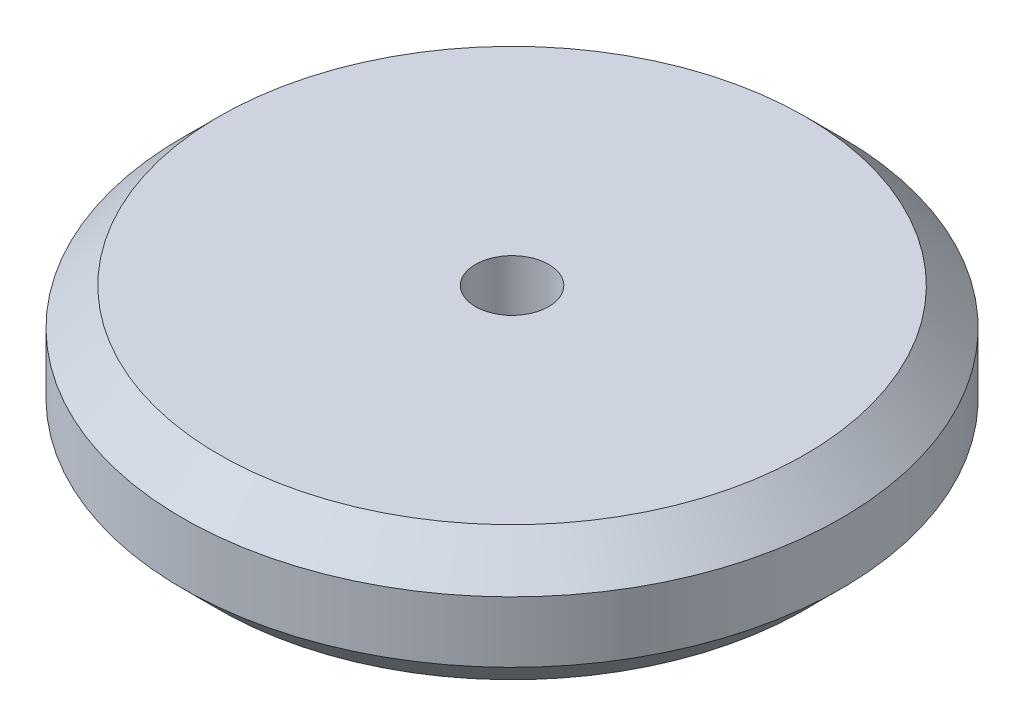
ISO-10303-21;
HEADER;
FILE_DESCRIPTION(('STEP AP214'),'2;1');
FILE_NAME('part.step','',(''),(''),'','','');
FILE_SCHEMA(('AUTOMOTIVE_DESIGN { 1 0 10303 214 1 1 1 1 }'));
ENDSEC;
DATA;
#1=APPLICATION_CONTEXT('core data for automotive mechanical design processes');
#2=APPLICATION_PROTOCOL_DEFINITION('international standard','automotive_design',2000,#1);
#3=PRODUCT_CONTEXT('',#1,'mechanical');
#4=PRODUCT('Part','Part','',(#3));
#5=PRODUCT_RELATED_PRODUCT_CATEGORY('part','',(#4));
#6=PRODUCT_DEFINITION_FORMATION('','',#4);
#7=PRODUCT_DEFINITION_CONTEXT('part definition',#1,'design');
#8=PRODUCT_DEFINITION('design','',#6,#7);
#9=PRODUCT_DEFINITION_SHAPE('','',#8);
#10=(LENGTH_UNIT() NAMED_UNIT(*) SI_UNIT(.MILLI.,.METRE.));
#11=(NAMED_UNIT(*) PLANE_ANGLE_UNIT() SI_UNIT($,.RADIAN.));
#12=(NAMED_UNIT(*) SI_UNIT($,.STERADIAN.) SOLID_ANGLE_UNIT());
#13=UNCERTAINTY_MEASURE_WITH_UNIT(LENGTH_MEASURE(1.E-05),#10,'distance_accuracy_value','');
#14=(GEOMETRIC_REPRESENTATION_CONTEXT(3) GLOBAL_UNCERTAINTY_ASSIGNED_CONTEXT((#13)) GLOBAL_UNIT_ASSIGNED_CONTEXT((#10,
#11,#12)) REPRESENTATION_CONTEXT('',''));
#15=CARTESIAN_POINT('',(0.,0.,0.));
#16=DIRECTION('',(0.,0.,1.));
#17=DIRECTION('',(1.,0.,0.));
#18=AXIS2_PLACEMENT_3D('',#15,#16,#17);
#19=CARTESIAN_POINT('',(10.,6.,0.));
#20=DIRECTION('',(0.,-1.,0.));
#21=DIRECTION('',(0.,0.,-1.));
#22=AXIS2_PLACEMENT_3D('',#19,#20,#21);
#23=PLANE('',#22);
#24=CARTESIAN_POINT('',(0.,6.,0.));
#25=DIRECTION('',(0.,-1.,0.));
#26=DIRECTION('',(0.,0.,-1.));
#27=AXIS2_PLACEMENT_3D('',#24,#25,#26);
#28=CIRCLE('',#27,24.);
#29=CARTESIAN_POINT('',(0.,6.,-24.));
#30=VERTEX_POINT('',#29);
#31=EDGE_CURVE('E10',#30,#30,#28,.T.);
#32=ORIENTED_EDGE('',*,*,#31,.T.);
#33=EDGE_LOOP('',(#32));
#34=FACE_BOUND('',#33,.T.);
#35=CARTESIAN_POINT('',(0.,6.,0.));
#36=DIRECTION('',(0.,-1.,0.));
#37=DIRECTION('',(0.,0.,-1.));
#38=AXIS2_PLACEMENT_3D('',#35,#36,#37);
#39=CIRCLE('',#38,10.);
#40=CARTESIAN_POINT('',(0.,6.,-10.));
#41=VERTEX_POINT('',#40);
#42=EDGE_CURVE('E64',#41,#41,#39,.T.);
#43=ORIENTED_EDGE('',*,*,#42,.F.);
#44=EDGE_LOOP('',(#43));
#45=FACE_BOUND('',#44,.T.);
#46=ADVANCED_FACE('F31',(#34,#45),#23,.T.);
#47=CARTESIAN_POINT('',(0.,6.,0.));
#48=DIRECTION('',(0.,1.,0.));
#49=DIRECTION('',(0.,0.,1.));
#50=AXIS2_PLACEMENT_3D('',#47,#48,#49);
#51=CONICAL_SURFACE('',#50,24.,0.785398163397448);
#52=CARTESIAN_POINT('',(0.,9.,0.));
#53=DIRECTION('',(0.,-1.,0.));
#54=DIRECTION('',(0.,0.,-1.));
#55=AXIS2_PLACEMENT_3D('',#52,#53,#54);
#56=CIRCLE('',#55,27.);
#57=CARTESIAN_POINT('',(0.,9.,-27.));
#58=VERTEX_POINT('',#57);
#59=EDGE_CURVE('E43',#58,#58,#56,.T.);
#60=ORIENTED_EDGE('',*,*,#59,.T.);
#61=EDGE_LOOP('',(#60));
#62=FACE_BOUND('',#61,.T.);
#63=ORIENTED_EDGE('',*,*,#31,.F.);
#64=EDGE_LOOP('',(#63));
#65=FACE_BOUND('',#64,.T.);
#66=ADVANCED_FACE('F96',(#62,#65),#51,.T.);
#67=CARTESIAN_POINT('',(0.,0.,0.));
#68=DIRECTION('',(0.,-1.,0.));
#69=DIRECTION('',(0.,0.,-1.));
#70=AXIS2_PLACEMENT_3D('',#67,#68,#69);
#71=CYLINDRICAL_SURFACE('',#70,27.);
#72=CARTESIAN_POINT('',(0.,14.,0.));
#73=DIRECTION('',(0.,-1.,0.));
#74=DIRECTION('',(0.,0.,-1.));
#75=AXIS2_PLACEMENT_3D('',#72,#73,#74);
#76=CIRCLE('',#75,27.);
#77=CARTESIAN_POINT('',(0.,14.,-27.));
#78=VERTEX_POINT('',#77);
#79=EDGE_CURVE('E47',#78,#78,#76,.T.);
#80=ORIENTED_EDGE('',*,*,#79,.T.);
#81=EDGE_LOOP('',(#80));
#82=FACE_BOUND('',#81,.T.);
#83=ORIENTED_EDGE('',*,*,#59,.F.);
#84=EDGE_LOOP('',(#83));
#85=FACE_BOUND('',#84,.T.);
#86=ADVANCED_FACE('F100',(#82,#85),#71,.T.);
#87=CARTESIAN_POINT('',(0.,14.,0.));
#88=DIRECTION('',(0.,-1.,0.));
#89=DIRECTION('',(0.,0.,-1.));
#90=AXIS2_PLACEMENT_3D('',#87,#88,#89);
#91=CONICAL_SURFACE('',#90,27.,0.785398163397448);
#92=CARTESIAN_POINT('',(0.,17.,0.));
#93=DIRECTION('',(0.,-1.,0.));
#94=DIRECTION('',(0.,0.,-1.));
#95=AXIS2_PLACEMENT_3D('',#92,#93,#94);
#96=CIRCLE('',#95,24.);
#97=CARTESIAN_POINT('',(0.,17.,-24.));
#98=VERTEX_POINT('',#97);
#99=EDGE_CURVE('E52',#98,#98,#96,.T.);
#100=ORIENTED_EDGE('',*,*,#99,.T.);
#101=EDGE_LOOP('',(#100));
#102=FACE_BOUND('',#101,.T.);
#103=ORIENTED_EDGE('',*,*,#79,.F.);
#104=EDGE_LOOP('',(#103));
#105=FACE_BOUND('',#104,.T.);
#106=ADVANCED_FACE('F110',(#102,#105),#91,.T.);
#107=CARTESIAN_POINT('',(24.,17.,0.));
#108=DIRECTION('',(0.,1.,0.));
#109=DIRECTION('',(0.,0.,1.));
#110=AXIS2_PLACEMENT_3D('',#107,#108,#109);
#111=PLANE('',#110);
#112=CARTESIAN_POINT('',(0.,17.,0.));
#113=DIRECTION('',(0.,-1.,0.));
#114=DIRECTION('',(0.,0.,-1.));
#115=AXIS2_PLACEMENT_3D('',#112,#113,#114);
#116=CIRCLE('',#115,3.);
#117=CARTESIAN_POINT('',(0.,17.,-3.));
#118=VERTEX_POINT('',#117);
#119=EDGE_CURVE('E55',#118,#118,#116,.T.);
#120=ORIENTED_EDGE('',*,*,#119,.T.);
#121=EDGE_LOOP('',(#120));
#122=FACE_BOUND('',#121,.T.);
#123=ORIENTED_EDGE('',*,*,#99,.F.);
#124=EDGE_LOOP('',(#123));
#125=FACE_BOUND('',#124,.T.);
#126=ADVANCED_FACE('F92',(#122,#125),#111,.T.);
#127=CARTESIAN_POINT('',(0.,0.,0.));
#128=DIRECTION('',(0.,-1.,0.));
#129=DIRECTION('',(0.,0.,-1.));
#130=AXIS2_PLACEMENT_3D('',#127,#128,#129);
#131=CYLINDRICAL_SURFACE('',#130,3.);
#132=CARTESIAN_POINT('',(0.,4.65,-3.));
#133=CARTESIAN_POINT('',(-0.0856699475452996,4.64999461662169,-2.99999513886583));
#134=CARTESIAN_POINT('',(-0.171409071205646,4.64328935440902,-2.99629302255545));
#135=CARTESIAN_POINT('',(-0.340286051726048,4.61679778476964,-2.9818478399119));
#136=CARTESIAN_POINT('',(-0.423420195379861,4.59699362165197,-2.97109516282084));
#137=CARTESIAN_POINT('',(-0.584401577928637,4.54534553567832,-2.9436571869529));
#138=CARTESIAN_POINT('',(-0.662269062667419,4.51355122137034,-2.92699634956489));
#139=CARTESIAN_POINT('',(-0.811408240635763,4.43912133182606,-2.8892116252981));
#140=CARTESIAN_POINT('',(-0.882679651896674,4.39648529341993,-2.86808754775153));
#141=CARTESIAN_POINT('',(-1.02211619357275,4.29828466687541,-2.82153252993505));
#142=CARTESIAN_POINT('',(-1.08973037342791,4.24203247555586,-2.79590528013301));
#143=CARTESIAN_POINT('',(-1.21508634233517,4.1197083915399,-2.74375354722835));
#144=CARTESIAN_POINT('',(-1.2728189023456,4.05362742563047,-2.71722825277821));
#145=CARTESIAN_POINT('',(-1.38251917690996,3.90577401407734,-2.66321895829991));
#146=CARTESIAN_POINT('',(-1.43335857713387,3.82309703851528,-2.635897965792));
#147=CARTESIAN_POINT('',(-1.52021547735939,3.64877263436737,-2.58678336476683));
#148=CARTESIAN_POINT('',(-1.5562446891168,3.55713236514275,-2.56498539395023));
#149=CARTESIAN_POINT('',(-1.60989890926138,3.3732305515727,-2.53163475086558));
#150=CARTESIAN_POINT('',(-1.62854263347079,3.28137384654717,-2.51952192354843));
#151=CARTESIAN_POINT('',(-1.64991120631134,3.09511055144333,-2.5055890563389));
#152=CARTESIAN_POINT('',(-1.65265887915297,3.00070781297602,-2.50375425894471));
#153=CARTESIAN_POINT('',(-1.64290000078864,2.82757164325043,-2.51015646726158));
#154=CARTESIAN_POINT('',(-1.63265157443424,2.74864024150067,-2.51690299364892));
#155=CARTESIAN_POINT('',(-1.60118639026894,2.59387058009675,-2.53703527550373));
#156=CARTESIAN_POINT('',(-1.5799646365691,2.5180337463059,-2.55042405491467));
#157=CARTESIAN_POINT('',(-1.52687641342515,2.3695176799991,-2.58256130946142));
#158=CARTESIAN_POINT('',(-1.49479033069661,2.2969417622077,-2.60141910516922));
#159=CARTESIAN_POINT('',(-1.42107429999088,2.15782897940317,-2.64240902469132));
#160=CARTESIAN_POINT('',(-1.37944023253661,2.09129473841806,-2.66454256035721));
#161=CARTESIAN_POINT('',(-1.28018349411555,1.95510521641988,-2.71379040847905));
#162=CARTESIAN_POINT('',(-1.22107458392543,1.88661394811561,-2.74113957142577));
#163=CARTESIAN_POINT('',(-1.09224532196501,1.75997341934865,-2.79497377887706));
#164=CARTESIAN_POINT('',(-1.02251777065964,1.70183123410758,-2.82145822218593));
#165=CARTESIAN_POINT('',(-0.868605041800937,1.59378517331662,-2.87272134052732));
#166=CARTESIAN_POINT('',(-0.783763861453044,1.54469535937108,-2.89726648156192));
#167=CARTESIAN_POINT('',(-0.605352377645233,1.46191924656253,-2.93971528365153));
#168=CARTESIAN_POINT('',(-0.511790381195994,1.42821846583331,-2.95762518579738));
#169=CARTESIAN_POINT('',(-0.327907037980978,1.38038778956176,-2.98333345624201));
#170=CARTESIAN_POINT('',(-0.238095480523289,1.36472744848248,-2.99191822782612));
#171=CARTESIAN_POINT('',(-0.0567325334425137,1.34846917129306,-3.00083376662002));
#172=CARTESIAN_POINT('',(0.0348177069344345,1.34786161003821,-3.00116980828416));
#173=CARTESIAN_POINT('',(0.207487375150858,1.36103451330555,-2.99394177831786));
#174=CARTESIAN_POINT('',(0.28875177623744,1.37341460128179,-2.98714659587173));
#175=CARTESIAN_POINT('',(0.447838849624848,1.40984259733264,-2.96746793830126));
#176=CARTESIAN_POINT('',(0.525661172937911,1.43389168556646,-2.95458384737082));
#177=CARTESIAN_POINT('',(0.677753407865904,1.49335761595169,-2.92349378037743));
#178=CARTESIAN_POINT('',(0.751904240945377,1.52901769554692,-2.90517475144826));
#179=CARTESIAN_POINT('',(0.893363199749704,1.61037134629973,-2.86484215103297));
#180=CARTESIAN_POINT('',(0.960668811424108,1.65606858448361,-2.8428272299655));
#181=CARTESIAN_POINT('',(1.09455456288909,1.76204471413836,-2.79420331593949));
#182=CARTESIAN_POINT('',(1.16021004375818,1.823383283659,-2.76735592347542));
#183=CARTESIAN_POINT('',(1.28079913012788,1.95592442967749,-2.71365440736755));
#184=CARTESIAN_POINT('',(1.33572155748716,2.02713715928237,-2.6868003055646));
#185=CARTESIAN_POINT('',(1.43747254066661,2.18416419340713,-2.63385875511374));
#186=CARTESIAN_POINT('',(1.48334076829298,2.27068307687537,-2.60799295737883));
#187=CARTESIAN_POINT('',(1.55942876653783,2.45199407970866,-2.56323063992907));
#188=CARTESIAN_POINT('',(1.58967133039468,2.54677391139992,-2.54432398053561));
#189=CARTESIAN_POINT('',(1.6306246255404,2.73226237758553,-2.51825420457375));
#190=CARTESIAN_POINT('',(1.64294477567078,2.8224747805395,-2.51013022153208));
#191=CARTESIAN_POINT('',(1.65249034912289,3.00401046928804,-2.50386093509844));
#192=CARTESIAN_POINT('',(1.64972872967261,3.09533273427257,-2.50570706604924));
#193=CARTESIAN_POINT('',(1.63075691736925,3.26321952155551,-2.51807870697285));
#194=CARTESIAN_POINT('',(1.61642825416935,3.34010097353313,-2.52738874118223));
#195=CARTESIAN_POINT('',(1.57741079979876,3.49019541895998,-2.55192145753237));
#196=CARTESIAN_POINT('',(1.55271775279779,3.56340689160001,-2.56714656833463));
#197=CARTESIAN_POINT('',(1.492056117962,3.70913964629297,-2.60289749299613));
#198=CARTESIAN_POINT('',(1.45548954002739,3.7813439958992,-2.62369085726804));
#199=CARTESIAN_POINT('',(1.37268509596929,3.91907602150034,-2.66794671801683));
#200=CARTESIAN_POINT('',(1.32644209751913,3.98460012678668,-2.69141062791391));
#201=CARTESIAN_POINT('',(1.21715006880685,4.11784973955534,-2.74276036037727));
#202=CARTESIAN_POINT('',(1.15260264369496,4.18430823518329,-2.770762457364));
#203=CARTESIAN_POINT('',(1.01279351012944,4.30588442742214,-2.82486614857147));
#204=CARTESIAN_POINT('',(0.937524174112386,4.360993981549,-2.85096636964491));
#205=CARTESIAN_POINT('',(0.774887264813827,4.45993803396586,-2.89948189270181));
#206=CARTESIAN_POINT('',(0.687189892415591,4.50331356440636,-2.92173740350452));
#207=CARTESIAN_POINT('',(0.504223640414895,4.57410971433075,-2.95878417900051));
#208=CARTESIAN_POINT('',(0.408974898948851,4.60157124777073,-2.97359457153256));
#209=CARTESIAN_POINT('',(0.260510618519073,4.63014205801229,-2.98911434756595));
#210=CARTESIAN_POINT('',(0.208783056433922,4.63757243201226,-2.99318008334623));
#211=CARTESIAN_POINT('',(0.104712273399592,4.64750301282089,-2.99862437594613));
#212=CARTESIAN_POINT('',(0.0523690613485742,4.65000329079773,-3.00000297155585));
#213=CARTESIAN_POINT('',(0.,4.65,-3.));
#214=B_SPLINE_CURVE_WITH_KNOTS('',3,(#132,#133,#134,#135,#136,#137,#138,#139,#140,#141,#142,
#143,#144,#145,#146,#147,#148,#149,#150,#151,#152,#153,#154,#155,#156,#157,#158,#159,#160,#161,
#162,#163,#164,#165,#166,#167,#168,#169,#170,#171,#172,#173,#174,#175,#176,#177,#178,#179,#180,
#181,#182,#183,#184,#185,#186,#187,#188,#189,#190,#191,#192,#193,#194,#195,#196,#197,#198,#199,
#200,#201,#202,#203,#204,#205,#206,#207,#208,#209,#210,#211,#212,#213),.UNSPECIFIED.,.T.,.F.,(4,
2,2,2,2,2,2,2,2,2,2,2,2,2,2,2,2,2,2,2,2,2,2,2,2,2,2,2,2,2,2,2,2,2,2,2,2,2,2,2,4),(0.,
0.256799016537927,0.513948810602823,0.770046131883809,1.02615439574975,1.29988051794781,
1.57386091081864,1.87483382859252,2.17556827984511,2.45730761481344,2.7386423161532,
2.97715628850379,3.21577894619804,3.45954576386221,3.70341795322454,3.98576982265922,
4.26831398861797,4.56980790280871,4.87101750814851,5.14417314031287,5.41715410504554,
5.66345591892144,5.90978264803878,6.16164305576709,6.41359563296035,6.69375293580822,
6.97420047673716,7.27643629132654,7.57822997932258,7.85076329691248,8.12306250931444,
8.3583013241963,8.59363682764367,8.84338665158087,9.09326927891543,9.3823498468417,
9.67163710326652,9.97098879991469,10.2695674268337,10.4265480013941,10.5835263098519),.UNSPECIFIED.);
#215=CARTESIAN_POINT('',(0.,4.65,-3.));
#216=VERTEX_POINT('',#215);
#217=EDGE_CURVE('E67',#216,#216,#214,.T.);
#218=ORIENTED_EDGE('',*,*,#217,.F.);
#219=EDGE_LOOP('',(#218));
#220=FACE_BOUND('',#219,.T.);
#221=CARTESIAN_POINT('',(0.,0.,0.));
#222=DIRECTION('',(0.,-1.,0.));
#223=DIRECTION('',(0.,0.,-1.));
#224=AXIS2_PLACEMENT_3D('',#221,#222,#223);
#225=CIRCLE('',#224,3.);
#226=CARTESIAN_POINT('',(0.,0.,-3.));
#227=VERTEX_POINT('',#226);
#228=EDGE_CURVE('E58',#227,#227,#225,.T.);
#229=ORIENTED_EDGE('',*,*,#228,.T.);
#230=EDGE_LOOP('',(#229));
#231=FACE_BOUND('',#230,.T.);
#232=ORIENTED_EDGE('',*,*,#119,.F.);
#233=EDGE_LOOP('',(#232));
#234=FACE_BOUND('',#233,.T.);
#235=ADVANCED_FACE('F73',(#220,#231,#234),#131,.F.);
#236=CARTESIAN_POINT('',(3.,0.,0.));
#237=DIRECTION('',(0.,-1.,0.));
#238=DIRECTION('',(0.,0.,-1.));
#239=AXIS2_PLACEMENT_3D('',#236,#237,#238);
#240=PLANE('',#239);
#241=CARTESIAN_POINT('',(0.,0.,0.));
#242=DIRECTION('',(0.,-1.,0.));
#243=DIRECTION('',(0.,0.,-1.));
#244=AXIS2_PLACEMENT_3D('',#241,#242,#243);
#245=CIRCLE('',#244,10.);
#246=CARTESIAN_POINT('',(0.,0.,-10.));
#247=VERTEX_POINT('',#246);
#248=EDGE_CURVE('E61',#247,#247,#245,.T.);
#249=ORIENTED_EDGE('',*,*,#248,.T.);
#250=EDGE_LOOP('',(#249));
#251=FACE_BOUND('',#250,.T.);
#252=ORIENTED_EDGE('',*,*,#228,.F.);
#253=EDGE_LOOP('',(#252));
#254=FACE_BOUND('',#253,.T.);
#255=ADVANCED_FACE('F85',(#251,#254),#240,.T.);
#256=CARTESIAN_POINT('',(0.,0.,0.));
#257=DIRECTION('',(0.,-1.,0.));
#258=DIRECTION('',(0.,0.,-1.));
#259=AXIS2_PLACEMENT_3D('',#256,#257,#258);
#260=CYLINDRICAL_SURFACE('',#259,10.);
#261=CARTESIAN_POINT('',(0.,4.65,-10.));
#262=CARTESIAN_POINT('',(0.0920114531057516,4.64999629901469,-9.99999843258099));
#263=CARTESIAN_POINT('',(0.184073454347173,4.64227754131458,-9.99871684765511));
#264=CARTESIAN_POINT('',(0.36561632253533,4.61161876486207,-9.99372775496381));
#265=CARTESIAN_POINT('',(0.45509472135177,4.5886646630412,-9.99001800272159));
#266=CARTESIAN_POINT('',(0.628817487751616,4.52824636106409,-9.98058875631552));
#267=CARTESIAN_POINT('',(0.713066038744486,4.4907939364397,-9.974870893487));
#268=CARTESIAN_POINT('',(0.874072236504043,4.40247274585138,-9.96205444853338));
#269=CARTESIAN_POINT('',(0.95083075765333,4.35160554849499,-9.95495602786423));
#270=CARTESIAN_POINT('',(1.09540879372213,4.23739122286708,-9.9400912001718));
#271=CARTESIAN_POINT('',(1.16314787882339,4.17394293638175,-9.93231968689365));
#272=CARTESIAN_POINT('',(1.28706950777735,4.03658522640677,-9.9170237472334));
#273=CARTESIAN_POINT('',(1.34325132909589,3.96267514935682,-9.90949933632427));
#274=CARTESIAN_POINT('',(1.44278500045253,3.80594065632332,-9.89550007731641));
#275=CARTESIAN_POINT('',(1.48605749570899,3.72306520565612,-9.88903182722124));
#276=CARTESIAN_POINT('',(1.55803674048925,3.55109737476351,-9.87794796970923));
#277=CARTESIAN_POINT('',(1.58674445381556,3.46200540635072,-9.87333223970889));
#278=CARTESIAN_POINT('',(1.6285261950301,3.28098541799901,-9.86652679242373));
#279=CARTESIAN_POINT('',(1.64173895927951,3.18909024432124,-9.86431555933323));
#280=CARTESIAN_POINT('',(1.65258585530687,3.00436263407657,-9.86250435770823));
#281=CARTESIAN_POINT('',(1.6502210677036,2.91153026296937,-9.86290420804218));
#282=CARTESIAN_POINT('',(1.63009303176278,2.72855272294329,-9.86625034802632));
#283=CARTESIAN_POINT('',(1.61248549472488,2.63838988597263,-9.86917088684506));
#284=CARTESIAN_POINT('',(1.5626160736781,2.4623159294666,-9.87718903199043));
#285=CARTESIAN_POINT('',(1.53035369619838,2.37640495321172,-9.88228671162733));
#286=CARTESIAN_POINT('',(1.45193210975571,2.21080647007558,-9.89411264039674));
#287=CARTESIAN_POINT('',(1.4057081060585,2.13115021075931,-9.90084846298694));
#288=CARTESIAN_POINT('',(1.30072141548377,1.98066567609225,-9.9151864393107));
#289=CARTESIAN_POINT('',(1.24195773629987,1.90983810008771,-9.92278866158316));
#290=CARTESIAN_POINT('',(1.11271072676603,1.77812002111733,-9.93811607123993));
#291=CARTESIAN_POINT('',(1.04209376928223,1.71736060537004,-9.94584163094155));
#292=CARTESIAN_POINT('',(0.891597059898566,1.60853397839373,-9.96045987838133));
#293=CARTESIAN_POINT('',(0.811717250503358,1.56046684595291,-9.9673525609492));
#294=CARTESIAN_POINT('',(0.644840083170754,1.47837784946568,-9.97953794169528));
#295=CARTESIAN_POINT('',(0.55783700315656,1.44436741236198,-9.98482933722619));
#296=CARTESIAN_POINT('',(0.379246930002471,1.39147808722466,-9.99320544362233));
#297=CARTESIAN_POINT('',(0.287660313260822,1.37259795885521,-9.99629033536768));
#298=CARTESIAN_POINT('',(0.103632983819161,1.35068253883883,-9.99988156603306));
#299=CARTESIAN_POINT('',(0.0112142564118354,1.34746726387846,-10.0004171933872));
#300=CARTESIAN_POINT('',(-0.172841505554682,1.35649319868026,-9.99892971175882));
#301=CARTESIAN_POINT('',(-0.264478569441165,1.36873382596047,-9.99690669920295));
#302=CARTESIAN_POINT('',(-0.44381495554177,1.4081744027771,-9.99054737820398));
#303=CARTESIAN_POINT('',(-0.531534371938303,1.43528539430835,-9.98622483070291));
#304=CARTESIAN_POINT('',(-0.701182959294594,1.50360239255507,-9.97574921956607));
#305=CARTESIAN_POINT('',(-0.783111810188991,1.54480917766168,-9.96959605484327));
#306=CARTESIAN_POINT('',(-0.939636398877253,1.64056131949898,-9.95606928426946));
#307=CARTESIAN_POINT('',(-1.01416235726447,1.6952192859171,-9.94868555427359));
#308=CARTESIAN_POINT('',(-1.15304841333209,1.81616714906879,-9.93354765732487));
#309=CARTESIAN_POINT('',(-1.21740778758216,1.88245787285429,-9.92579346406183));
#310=CARTESIAN_POINT('',(-1.33479962911472,2.0255961063283,-9.91069407401676));
#311=CARTESIAN_POINT('',(-1.38771058951944,2.10254387109881,-9.90335382329475));
#312=CARTESIAN_POINT('',(-1.47985547415617,2.26434104706746,-9.89000528724129));
#313=CARTESIAN_POINT('',(-1.51908982562647,2.34919021133191,-9.88399696030451));
#314=CARTESIAN_POINT('',(-1.58258535747086,2.52403953240315,-9.87402953570153));
#315=CARTESIAN_POINT('',(-1.60690737863649,2.61401709979667,-9.87006212213643));
#316=CARTESIAN_POINT('',(-1.64007952798876,2.79685131178056,-9.86460473721113));
#317=CARTESIAN_POINT('',(-1.64893097191819,2.88970771084816,-9.86311455516768));
#318=CARTESIAN_POINT('',(-1.65087457438796,3.07445064130181,-9.86278931217107));
#319=CARTESIAN_POINT('',(-1.64415796786954,3.16633516019211,-9.86392203182987));
#320=CARTESIAN_POINT('',(-1.61556925478547,3.34764775186387,-9.86864441177183));
#321=CARTESIAN_POINT('',(-1.59369719454886,3.4370758321536,-9.87223406454433));
#322=CARTESIAN_POINT('',(-1.53549112071357,3.61086524243541,-9.88145370519205));
#323=CARTESIAN_POINT('',(-1.49917324977366,3.69523210745097,-9.88708141498759));
#324=CARTESIAN_POINT('',(-1.41312606218935,3.85670626686033,-9.8997453323177));
#325=CARTESIAN_POINT('',(-1.36339610211421,3.93381321272773,-9.90678160742252));
#326=CARTESIAN_POINT('',(-1.25125259966706,4.07954549763769,-9.92157214136343));
#327=CARTESIAN_POINT('',(-1.18869826623127,4.14806175981957,-9.92933379899765));
#328=CARTESIAN_POINT('',(-1.05297867490409,4.27369059987676,-9.94464125601211));
#329=CARTESIAN_POINT('',(-0.979810970092673,4.33080054078024,-9.95218700513286));
#330=CARTESIAN_POINT('',(-0.824354696103048,4.43234742257349,-9.96627143049842));
#331=CARTESIAN_POINT('',(-0.742007852048188,4.47669614797803,-9.97280295936929));
#332=CARTESIAN_POINT('',(-0.570959586923796,4.55086335280631,-9.98405342047581));
#333=CARTESIAN_POINT('',(-0.482264623543764,4.58069636412524,-9.98877416450827));
#334=CARTESIAN_POINT('',(-0.327682758240929,4.61847934152685,-9.99483601455804));
#335=CARTESIAN_POINT('',(-0.262733066711101,4.6302807488145,-9.99676220083327));
#336=CARTESIAN_POINT('',(-0.131864227625941,4.64604233893311,-9.99934474465587));
#337=CARTESIAN_POINT('',(-0.0659450962546691,4.65000265251579,-10.0000011233775));
#338=CARTESIAN_POINT('',(0.,4.65,-10.));
#339=B_SPLINE_CURVE_WITH_KNOTS('',3,(#261,#262,#263,#264,#265,#266,#267,#268,#269,#270,#271,
#272,#273,#274,#275,#276,#277,#278,#279,#280,#281,#282,#283,#284,#285,#286,#287,#288,#289,#290,
#291,#292,#293,#294,#295,#296,#297,#298,#299,#300,#301,#302,#303,#304,#305,#306,#307,#308,#309,
#310,#311,#312,#313,#314,#315,#316,#317,#318,#319,#320,#321,#322,#323,#324,#325,#326,#327,#328,
#329,#330,#331,#332,#333,#334,#335,#336,#337,#338),.UNSPECIFIED.,.T.,.F.,(4,2,2,2,2,2,2,2,2,2,2,
2,2,2,2,2,2,2,2,2,2,2,2,2,2,2,2,2,2,2,2,2,2,2,2,2,2,2,4),(0.,0.275793319008919,
0.551841928312974,0.827666799870601,1.10345943314171,1.38156673144316,1.65969141110742,
1.93949209608634,2.21927426326045,2.49653175525207,2.7737700140227,3.04820914252878,
3.32265751287873,3.59839967320043,3.87416366201708,4.15327572401922,4.43238951858749,
4.71172976565334,4.99104711092802,5.26714751096619,5.54323750600191,5.81769359979006,
6.09216485190805,6.36901711215388,6.6458890636926,6.92556925596461,7.2052407106323,
7.48376340648035,7.76226241335699,8.03735855216248,8.31245385002405,8.58724259883662,
8.86204453269319,9.1400425875962,9.41810483731135,9.69804546871321,9.97770526783285,
10.1753710978728,10.3730336317699),.UNSPECIFIED.);
#340=CARTESIAN_POINT('',(0.,4.65,-10.));
#341=VERTEX_POINT('',#340);
#342=EDGE_CURVE('E34',#341,#341,#339,.T.);
#343=ORIENTED_EDGE('',*,*,#342,.F.);
#344=EDGE_LOOP('',(#343));
#345=FACE_BOUND('',#344,.T.);
#346=ORIENTED_EDGE('',*,*,#42,.T.);
#347=EDGE_LOOP('',(#346));
#348=FACE_BOUND('',#347,.T.);
#349=ORIENTED_EDGE('',*,*,#248,.F.);
#350=EDGE_LOOP('',(#349));
#351=FACE_BOUND('',#350,.T.);
#352=ADVANCED_FACE('F80',(#345,#348,#351),#260,.T.);
#353=CARTESIAN_POINT('',(0.,3.,-27.));
#354=DIRECTION('',(0.,0.,1.));
#355=DIRECTION('',(1.,0.,0.));
#356=AXIS2_PLACEMENT_3D('',#353,#354,#355);
#357=CYLINDRICAL_SURFACE('',#356,1.65);
#358=ORIENTED_EDGE('',*,*,#217,.T.);
#359=EDGE_LOOP('',(#358));
#360=FACE_BOUND('',#359,.T.);
#361=ORIENTED_EDGE('',*,*,#342,.T.);
#362=EDGE_LOOP('',(#361));
#363=FACE_BOUND('',#362,.T.);
#364=ADVANCED_FACE('F77',(#360,#363),#357,.F.);
#365=CLOSED_SHELL('',(#46,#66,#86,#106,#126,#235,#255,#352,#364));
#366=MANIFOLD_SOLID_BREP('B2',#365);
#367=ADVANCED_BREP_SHAPE_REPRESENTATION('',(#18,#366),#14);
#368=SHAPE_DEFINITION_REPRESENTATION(#9,#367);
ENDSEC;
END-ISO-10303-21;
